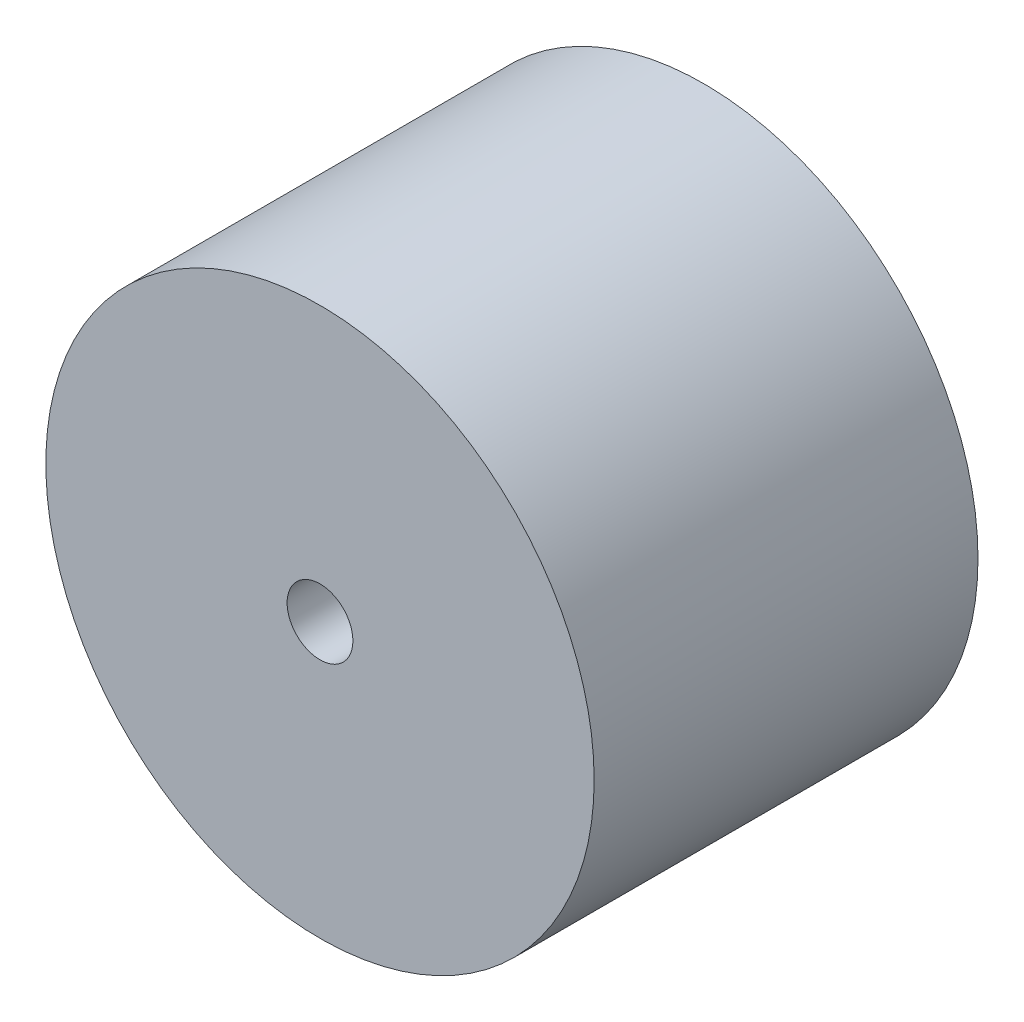
ISO-10303-21;
HEADER;
FILE_DESCRIPTION(('STEP AP214'),'2;1');
FILE_NAME('part.step','',(''),(''),'','','');
FILE_SCHEMA(('AUTOMOTIVE_DESIGN { 1 0 10303 214 1 1 1 1 }'));
ENDSEC;
DATA;
#1=APPLICATION_CONTEXT('core data for automotive mechanical design processes');
#2=APPLICATION_PROTOCOL_DEFINITION('international standard','automotive_design',2000,#1);
#3=PRODUCT_CONTEXT('',#1,'mechanical');
#4=PRODUCT('Part','Part','',(#3));
#5=PRODUCT_RELATED_PRODUCT_CATEGORY('part','',(#4));
#6=PRODUCT_DEFINITION_FORMATION('','',#4);
#7=PRODUCT_DEFINITION_CONTEXT('part definition',#1,'design');
#8=PRODUCT_DEFINITION('design','',#6,#7);
#9=PRODUCT_DEFINITION_SHAPE('','',#8);
#10=(LENGTH_UNIT() NAMED_UNIT(*) SI_UNIT(.MILLI.,.METRE.));
#11=(NAMED_UNIT(*) PLANE_ANGLE_UNIT() SI_UNIT($,.RADIAN.));
#12=(NAMED_UNIT(*) SI_UNIT($,.STERADIAN.) SOLID_ANGLE_UNIT());
#13=UNCERTAINTY_MEASURE_WITH_UNIT(LENGTH_MEASURE(1.E-05),#10,'distance_accuracy_value','');
#14=(GEOMETRIC_REPRESENTATION_CONTEXT(3) GLOBAL_UNCERTAINTY_ASSIGNED_CONTEXT((#13)) GLOBAL_UNIT_ASSIGNED_CONTEXT((#10,
#11,#12)) REPRESENTATION_CONTEXT('',''));
#15=CARTESIAN_POINT('',(0.,0.,0.));
#16=DIRECTION('',(0.,0.,1.));
#17=DIRECTION('',(1.,0.,0.));
#18=AXIS2_PLACEMENT_3D('',#15,#16,#17);
#19=CARTESIAN_POINT('',(0.,0.,17.5));
#20=DIRECTION('',(0.,0.,1.));
#21=DIRECTION('',(1.,0.,0.));
#22=AXIS2_PLACEMENT_3D('',#19,#20,#21);
#23=PLANE('',#22);
#24=CARTESIAN_POINT('',(0.,0.,17.5));
#25=DIRECTION('',(0.,0.,1.));
#26=DIRECTION('',(1.,0.,0.));
#27=AXIS2_PLACEMENT_3D('',#24,#25,#26);
#28=CIRCLE('',#27,25.);
#29=CARTESIAN_POINT('',(25.,0.,17.5));
#30=VERTEX_POINT('',#29);
#31=EDGE_CURVE('E10',#30,#30,#28,.T.);
#32=ORIENTED_EDGE('',*,*,#31,.T.);
#33=EDGE_LOOP('',(#32));
#34=FACE_BOUND('',#33,.T.);
#35=CARTESIAN_POINT('',(0.,0.,17.5));
#36=DIRECTION('',(0.,0.,1.));
#37=DIRECTION('',(1.,0.,0.));
#38=AXIS2_PLACEMENT_3D('',#35,#36,#37);
#39=CIRCLE('',#38,3.);
#40=CARTESIAN_POINT('',(3.,0.,17.5));
#41=VERTEX_POINT('',#40);
#42=EDGE_CURVE('E44',#41,#41,#39,.T.);
#43=ORIENTED_EDGE('',*,*,#42,.F.);
#44=EDGE_LOOP('',(#43));
#45=FACE_BOUND('',#44,.T.);
#46=ADVANCED_FACE('F33',(#34,#45),#23,.T.);
#47=CARTESIAN_POINT('',(0.,0.,-17.5));
#48=DIRECTION('',(0.,0.,1.));
#49=DIRECTION('',(1.,0.,0.));
#50=AXIS2_PLACEMENT_3D('',#47,#48,#49);
#51=PLANE('',#50);
#52=CARTESIAN_POINT('',(0.,0.,-17.5));
#53=DIRECTION('',(0.,0.,1.));
#54=DIRECTION('',(1.,0.,0.));
#55=AXIS2_PLACEMENT_3D('',#52,#53,#54);
#56=CIRCLE('',#55,25.);
#57=CARTESIAN_POINT('',(25.,0.,-17.5));
#58=VERTEX_POINT('',#57);
#59=EDGE_CURVE('E37',#58,#58,#56,.T.);
#60=ORIENTED_EDGE('',*,*,#59,.F.);
#61=EDGE_LOOP('',(#60));
#62=FACE_BOUND('',#61,.T.);
#63=CARTESIAN_POINT('',(0.,0.,-17.5));
#64=DIRECTION('',(0.,0.,1.));
#65=DIRECTION('',(1.,0.,0.));
#66=AXIS2_PLACEMENT_3D('',#63,#64,#65);
#67=CIRCLE('',#66,3.);
#68=CARTESIAN_POINT('',(3.,0.,-17.5));
#69=VERTEX_POINT('',#68);
#70=EDGE_CURVE('E46',#69,#69,#67,.T.);
#71=ORIENTED_EDGE('',*,*,#70,.T.);
#72=EDGE_LOOP('',(#71));
#73=FACE_BOUND('',#72,.T.);
#74=ADVANCED_FACE('F56',(#62,#73),#51,.F.);
#75=CARTESIAN_POINT('',(0.,0.,17.5));
#76=DIRECTION('',(0.,0.,-1.));
#77=DIRECTION('',(-1.,0.,0.));
#78=AXIS2_PLACEMENT_3D('',#75,#76,#77);
#79=CYLINDRICAL_SURFACE('',#78,25.);
#80=ORIENTED_EDGE('',*,*,#31,.F.);
#81=EDGE_LOOP('',(#80));
#82=FACE_BOUND('',#81,.T.);
#83=ORIENTED_EDGE('',*,*,#59,.T.);
#84=EDGE_LOOP('',(#83));
#85=FACE_BOUND('',#84,.T.);
#86=ADVANCED_FACE('F35',(#82,#85),#79,.T.);
#87=CARTESIAN_POINT('',(0.,0.,17.5));
#88=DIRECTION('',(0.,0.,-1.));
#89=DIRECTION('',(-1.,0.,0.));
#90=AXIS2_PLACEMENT_3D('',#87,#88,#89);
#91=CYLINDRICAL_SURFACE('',#90,3.);
#92=ORIENTED_EDGE('',*,*,#42,.T.);
#93=EDGE_LOOP('',(#92));
#94=FACE_BOUND('',#93,.T.);
#95=ORIENTED_EDGE('',*,*,#70,.F.);
#96=EDGE_LOOP('',(#95));
#97=FACE_BOUND('',#96,.T.);
#98=ADVANCED_FACE('F52',(#94,#97),#91,.F.);
#99=CLOSED_SHELL('',(#46,#74,#86,#98));
#100=MANIFOLD_SOLID_BREP('B2',#99);
#101=ADVANCED_BREP_SHAPE_REPRESENTATION('',(#18,#100),#14);
#102=SHAPE_DEFINITION_REPRESENTATION(#9,#101);
ENDSEC;
END-ISO-10303-21;
